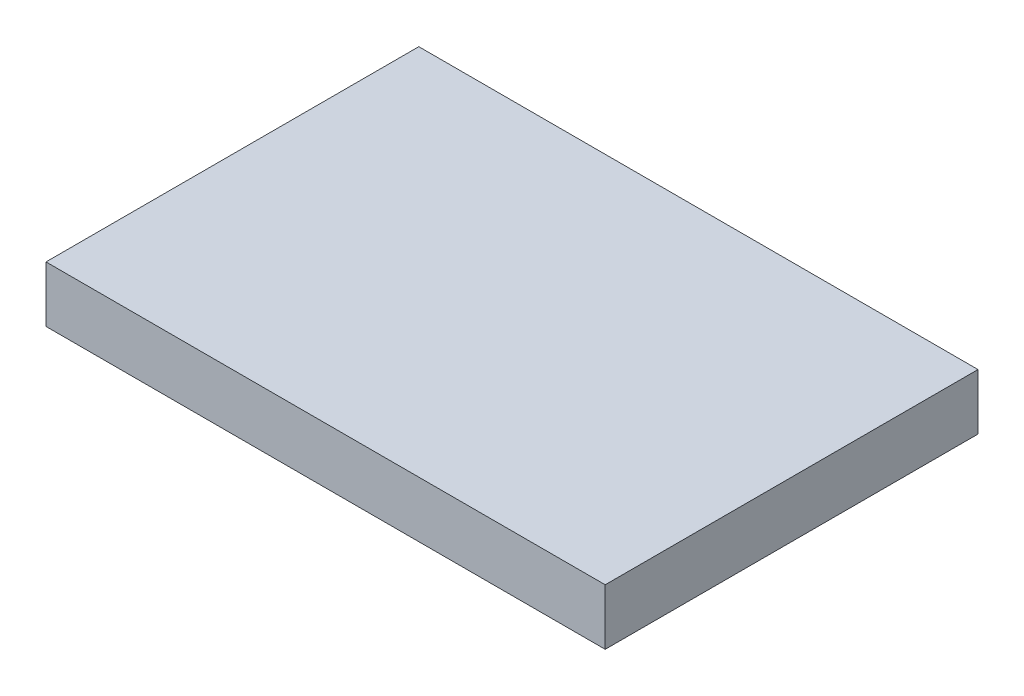
ISO-10303-21;
HEADER;
FILE_DESCRIPTION(('STEP AP214'),'2;1');
FILE_NAME('part.step','',(''),(''),'','','');
FILE_SCHEMA(('AUTOMOTIVE_DESIGN { 1 0 10303 214 1 1 1 1 }'));
ENDSEC;
DATA;
#1=APPLICATION_CONTEXT('core data for automotive mechanical design processes');
#2=APPLICATION_PROTOCOL_DEFINITION('international standard','automotive_design',2000,#1);
#3=PRODUCT_CONTEXT('',#1,'mechanical');
#4=PRODUCT('Part','Part','',(#3));
#5=PRODUCT_RELATED_PRODUCT_CATEGORY('part','',(#4));
#6=PRODUCT_DEFINITION_FORMATION('','',#4);
#7=PRODUCT_DEFINITION_CONTEXT('part definition',#1,'design');
#8=PRODUCT_DEFINITION('design','',#6,#7);
#9=PRODUCT_DEFINITION_SHAPE('','',#8);
#10=(LENGTH_UNIT() NAMED_UNIT(*) SI_UNIT(.MILLI.,.METRE.));
#11=(NAMED_UNIT(*) PLANE_ANGLE_UNIT() SI_UNIT($,.RADIAN.));
#12=(NAMED_UNIT(*) SI_UNIT($,.STERADIAN.) SOLID_ANGLE_UNIT());
#13=UNCERTAINTY_MEASURE_WITH_UNIT(LENGTH_MEASURE(1.E-05),#10,'distance_accuracy_value','');
#14=(GEOMETRIC_REPRESENTATION_CONTEXT(3) GLOBAL_UNCERTAINTY_ASSIGNED_CONTEXT((#13)) GLOBAL_UNIT_ASSIGNED_CONTEXT((#10,
#11,#12)) REPRESENTATION_CONTEXT('',''));
#15=CARTESIAN_POINT('',(0.,0.,0.));
#16=DIRECTION('',(0.,0.,1.));
#17=DIRECTION('',(1.,0.,0.));
#18=AXIS2_PLACEMENT_3D('',#15,#16,#17);
#19=CARTESIAN_POINT('',(-250.,30.,100.));
#20=DIRECTION('',(1.,0.,0.));
#21=DIRECTION('',(0.,0.,-1.));
#22=AXIS2_PLACEMENT_3D('',#19,#20,#21);
#23=PLANE('',#22);
#24=DIRECTION('',(0.,0.,1.));
#25=VECTOR('',#24,1.);
#26=CARTESIAN_POINT('',(-250.,0.,100.));
#27=LINE('',#26,#25);
#28=CARTESIAN_POINT('',(-250.,0.,-100.));
#29=VERTEX_POINT('',#28);
#30=CARTESIAN_POINT('',(-250.,0.,100.));
#31=VERTEX_POINT('',#30);
#32=EDGE_CURVE('E96',#29,#31,#27,.T.);
#33=ORIENTED_EDGE('',*,*,#32,.T.);
#34=DIRECTION('',(0.,-1.,0.));
#35=VECTOR('',#34,1.);
#36=CARTESIAN_POINT('',(-250.,30.,100.));
#37=LINE('',#36,#35);
#38=CARTESIAN_POINT('',(-250.,30.,100.));
#39=VERTEX_POINT('',#38);
#40=EDGE_CURVE('E11',#39,#31,#37,.T.);
#41=ORIENTED_EDGE('',*,*,#40,.F.);
#42=DIRECTION('',(0.,0.,1.));
#43=VECTOR('',#42,1.);
#44=CARTESIAN_POINT('',(-250.,30.,100.));
#45=LINE('',#44,#43);
#46=CARTESIAN_POINT('',(-250.,30.,-100.));
#47=VERTEX_POINT('',#46);
#48=EDGE_CURVE('E84',#47,#39,#45,.T.);
#49=ORIENTED_EDGE('',*,*,#48,.F.);
#50=DIRECTION('',(0.,-1.,0.));
#51=VECTOR('',#50,1.);
#52=CARTESIAN_POINT('',(-250.,30.,-100.));
#53=LINE('',#52,#51);
#54=EDGE_CURVE('E92',#47,#29,#53,.T.);
#55=ORIENTED_EDGE('',*,*,#54,.T.);
#56=EDGE_LOOP('',(#33,#41,#49,#55));
#57=FACE_BOUND('',#56,.T.);
#58=ADVANCED_FACE('F33',(#57),#23,.F.);
#59=CARTESIAN_POINT('',(-250.,30.,100.));
#60=DIRECTION('',(0.,0.,-1.));
#61=DIRECTION('',(-1.,0.,0.));
#62=AXIS2_PLACEMENT_3D('',#59,#60,#61);
#63=PLANE('',#62);
#64=DIRECTION('',(1.,0.,0.));
#65=VECTOR('',#64,1.);
#66=CARTESIAN_POINT('',(-250.,0.,100.));
#67=LINE('',#66,#65);
#68=CARTESIAN_POINT('',(50.,0.,100.));
#69=VERTEX_POINT('',#68);
#70=EDGE_CURVE('E88',#31,#69,#67,.T.);
#71=ORIENTED_EDGE('',*,*,#70,.T.);
#72=DIRECTION('',(0.,-1.,0.));
#73=VECTOR('',#72,1.);
#74=CARTESIAN_POINT('',(50.,30.,100.));
#75=LINE('',#74,#73);
#76=CARTESIAN_POINT('',(50.,30.,100.));
#77=VERTEX_POINT('',#76);
#78=EDGE_CURVE('E41',#77,#69,#75,.T.);
#79=ORIENTED_EDGE('',*,*,#78,.F.);
#80=DIRECTION('',(1.,0.,0.));
#81=VECTOR('',#80,1.);
#82=CARTESIAN_POINT('',(-250.,30.,100.));
#83=LINE('',#82,#81);
#84=EDGE_CURVE('E79',#39,#77,#83,.T.);
#85=ORIENTED_EDGE('',*,*,#84,.F.);
#86=ORIENTED_EDGE('',*,*,#40,.T.);
#87=EDGE_LOOP('',(#71,#79,#85,#86));
#88=FACE_BOUND('',#87,.T.);
#89=ADVANCED_FACE('F87',(#88),#63,.F.);
#90=CARTESIAN_POINT('',(50.,30.,100.));
#91=DIRECTION('',(-1.,0.,0.));
#92=DIRECTION('',(0.,0.,1.));
#93=AXIS2_PLACEMENT_3D('',#90,#91,#92);
#94=PLANE('',#93);
#95=DIRECTION('',(0.,0.,-1.));
#96=VECTOR('',#95,1.);
#97=CARTESIAN_POINT('',(50.,0.,100.));
#98=LINE('',#97,#96);
#99=CARTESIAN_POINT('',(50.,0.,-100.));
#100=VERTEX_POINT('',#99);
#101=EDGE_CURVE('E66',#69,#100,#98,.T.);
#102=ORIENTED_EDGE('',*,*,#101,.T.);
#103=DIRECTION('',(0.,-1.,0.));
#104=VECTOR('',#103,1.);
#105=CARTESIAN_POINT('',(50.,30.,-100.));
#106=LINE('',#105,#104);
#107=CARTESIAN_POINT('',(50.,30.,-100.));
#108=VERTEX_POINT('',#107);
#109=EDGE_CURVE('E89',#108,#100,#106,.T.);
#110=ORIENTED_EDGE('',*,*,#109,.F.);
#111=DIRECTION('',(0.,0.,-1.));
#112=VECTOR('',#111,1.);
#113=CARTESIAN_POINT('',(50.,30.,100.));
#114=LINE('',#113,#112);
#115=EDGE_CURVE('E82',#77,#108,#114,.T.);
#116=ORIENTED_EDGE('',*,*,#115,.F.);
#117=ORIENTED_EDGE('',*,*,#78,.T.);
#118=EDGE_LOOP('',(#102,#110,#116,#117));
#119=FACE_BOUND('',#118,.T.);
#120=ADVANCED_FACE('F90',(#119),#94,.F.);
#121=CARTESIAN_POINT('',(-250.,30.,-100.));
#122=DIRECTION('',(0.,0.,1.));
#123=DIRECTION('',(1.,0.,0.));
#124=AXIS2_PLACEMENT_3D('',#121,#122,#123);
#125=PLANE('',#124);
#126=DIRECTION('',(-1.,0.,0.));
#127=VECTOR('',#126,1.);
#128=CARTESIAN_POINT('',(-250.,0.,-100.));
#129=LINE('',#128,#127);
#130=EDGE_CURVE('E72',#100,#29,#129,.T.);
#131=ORIENTED_EDGE('',*,*,#130,.T.);
#132=ORIENTED_EDGE('',*,*,#54,.F.);
#133=DIRECTION('',(-1.,0.,0.));
#134=VECTOR('',#133,1.);
#135=CARTESIAN_POINT('',(-250.,30.,-100.));
#136=LINE('',#135,#134);
#137=EDGE_CURVE('E49',#108,#47,#136,.T.);
#138=ORIENTED_EDGE('',*,*,#137,.F.);
#139=ORIENTED_EDGE('',*,*,#109,.T.);
#140=EDGE_LOOP('',(#131,#132,#138,#139));
#141=FACE_BOUND('',#140,.T.);
#142=ADVANCED_FACE('F103',(#141),#125,.F.);
#143=CARTESIAN_POINT('',(-250.,30.,-100.));
#144=DIRECTION('',(0.,-1.,0.));
#145=DIRECTION('',(0.,0.,-1.));
#146=AXIS2_PLACEMENT_3D('',#143,#144,#145);
#147=PLANE('',#146);
#148=ORIENTED_EDGE('',*,*,#48,.T.);
#149=ORIENTED_EDGE('',*,*,#84,.T.);
#150=ORIENTED_EDGE('',*,*,#115,.T.);
#151=ORIENTED_EDGE('',*,*,#137,.T.);
#152=EDGE_LOOP('',(#148,#149,#150,#151));
#153=FACE_BOUND('',#152,.T.);
#154=ADVANCED_FACE('F80',(#153),#147,.F.);
#155=CARTESIAN_POINT('',(-250.,0.,-100.));
#156=DIRECTION('',(0.,-1.,0.));
#157=DIRECTION('',(0.,0.,-1.));
#158=AXIS2_PLACEMENT_3D('',#155,#156,#157);
#159=PLANE('',#158);
#160=ORIENTED_EDGE('',*,*,#32,.F.);
#161=ORIENTED_EDGE('',*,*,#130,.F.);
#162=ORIENTED_EDGE('',*,*,#101,.F.);
#163=ORIENTED_EDGE('',*,*,#70,.F.);
#164=EDGE_LOOP('',(#160,#161,#162,#163));
#165=FACE_BOUND('',#164,.T.);
#166=ADVANCED_FACE('F106',(#165),#159,.T.);
#167=CLOSED_SHELL('',(#58,#89,#120,#142,#154,#166));
#168=MANIFOLD_SOLID_BREP('B2',#167);
#169=ADVANCED_BREP_SHAPE_REPRESENTATION('',(#18,#168),#14);
#170=SHAPE_DEFINITION_REPRESENTATION(#9,#169);
ENDSEC;
END-ISO-10303-21;
